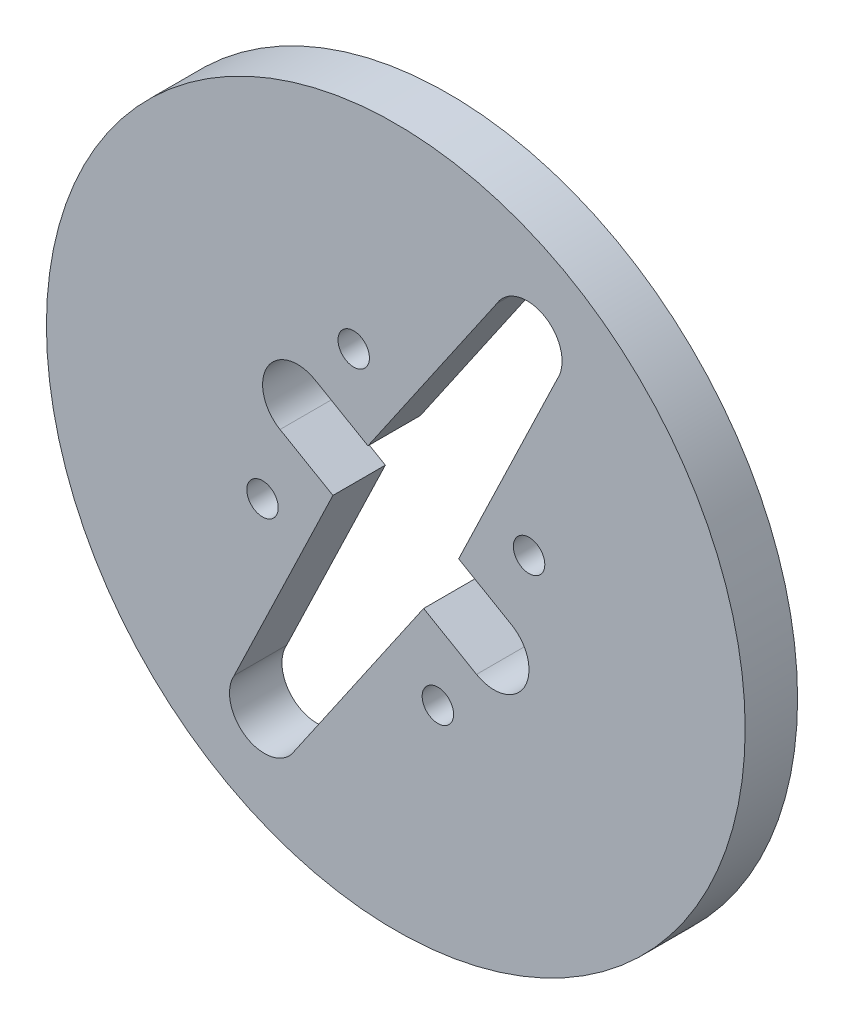
ISO-10303-21;
HEADER;
FILE_DESCRIPTION(('STEP AP214'),'2;1');
FILE_NAME('part.step','',(''),(''),'','','');
FILE_SCHEMA(('AUTOMOTIVE_DESIGN { 1 0 10303 214 1 1 1 1 }'));
ENDSEC;
DATA;
#1=APPLICATION_CONTEXT('core data for automotive mechanical design processes');
#2=APPLICATION_PROTOCOL_DEFINITION('international standard','automotive_design',2000,#1);
#3=PRODUCT_CONTEXT('',#1,'mechanical');
#4=PRODUCT('Part','Part','',(#3));
#5=PRODUCT_RELATED_PRODUCT_CATEGORY('part','',(#4));
#6=PRODUCT_DEFINITION_FORMATION('','',#4);
#7=PRODUCT_DEFINITION_CONTEXT('part definition',#1,'design');
#8=PRODUCT_DEFINITION('design','',#6,#7);
#9=PRODUCT_DEFINITION_SHAPE('','',#8);
#10=(LENGTH_UNIT() NAMED_UNIT(*) SI_UNIT(.MILLI.,.METRE.));
#11=(NAMED_UNIT(*) PLANE_ANGLE_UNIT() SI_UNIT($,.RADIAN.));
#12=(NAMED_UNIT(*) SI_UNIT($,.STERADIAN.) SOLID_ANGLE_UNIT());
#13=UNCERTAINTY_MEASURE_WITH_UNIT(LENGTH_MEASURE(1.E-05),#10,'distance_accuracy_value','');
#14=(GEOMETRIC_REPRESENTATION_CONTEXT(3) GLOBAL_UNCERTAINTY_ASSIGNED_CONTEXT((#13)) GLOBAL_UNIT_ASSIGNED_CONTEXT((#10,
#11,#12)) REPRESENTATION_CONTEXT('',''));
#15=CARTESIAN_POINT('',(0.,0.,0.));
#16=DIRECTION('',(0.,0.,1.));
#17=DIRECTION('',(1.,0.,0.));
#18=AXIS2_PLACEMENT_3D('',#15,#16,#17);
#19=CARTESIAN_POINT('',(2.59213585311026,-1.7801873533811,3.));
#20=DIRECTION('',(0.824324794546752,-0.566117154920654,0.));
#21=DIRECTION('',(0.566117154920654,0.824324794546752,0.));
#22=AXIS2_PLACEMENT_3D('',#19,#20,#21);
#23=PLANE('',#22);
#24=DIRECTION('',(-0.566117154920654,-0.824324794546752,0.));
#25=VECTOR('',#24,1.);
#26=CARTESIAN_POINT('',(2.59213585311026,-1.7801873533811,0.));
#27=LINE('',#26,#25);
#28=CARTESIAN_POINT('',(1.5934941670672,-3.23431234415027,0.));
#29=VERTEX_POINT('',#28);
#30=CARTESIAN_POINT('',(-5.78777046890322,-13.982192710705,0.));
#31=VERTEX_POINT('',#30);
#32=EDGE_CURVE('E161',#29,#31,#27,.T.);
#33=ORIENTED_EDGE('',*,*,#32,.T.);
#34=DIRECTION('',(0.,0.,-1.));
#35=VECTOR('',#34,1.);
#36=CARTESIAN_POINT('',(-5.78777046890322,-13.982192710705,3.));
#37=LINE('',#36,#35);
#38=CARTESIAN_POINT('',(-5.78777046890322,-13.982192710705,3.));
#39=VERTEX_POINT('',#38);
#40=EDGE_CURVE('E11',#39,#31,#37,.T.);
#41=ORIENTED_EDGE('',*,*,#40,.F.);
#42=DIRECTION('',(-0.566117154920654,-0.824324794546752,0.));
#43=VECTOR('',#42,1.);
#44=CARTESIAN_POINT('',(2.59213585311026,-1.7801873533811,3.));
#45=LINE('',#44,#43);
#46=CARTESIAN_POINT('',(1.5934941670672,-3.23431234415027,3.));
#47=VERTEX_POINT('',#46);
#48=EDGE_CURVE('E226',#47,#39,#45,.T.);
#49=ORIENTED_EDGE('',*,*,#48,.F.);
#50=DIRECTION('',(0.,0.,-1.));
#51=VECTOR('',#50,1.);
#52=CARTESIAN_POINT('',(1.5934941670672,-3.23431234415027,3.));
#53=LINE('',#52,#51);
#54=EDGE_CURVE('E50',#47,#29,#53,.T.);
#55=ORIENTED_EDGE('',*,*,#54,.T.);
#56=EDGE_LOOP('',(#33,#41,#49,#55));
#57=FACE_BOUND('',#56,.T.);
#58=ADVANCED_FACE('F33',(#57),#23,.F.);
#59=CARTESIAN_POINT('',(-7.51840234421123,-12.9797390648102,3.));
#60=DIRECTION('',(0.,0.,-1.));
#61=DIRECTION('',(-1.,0.,0.));
#62=AXIS2_PLACEMENT_3D('',#59,#60,#61);
#63=CYLINDRICAL_SURFACE('',#62,2.);
#64=CARTESIAN_POINT('',(-7.51840234421123,-12.9797390648102,0.));
#65=DIRECTION('',(0.,0.,1.));
#66=DIRECTION('',(1.,0.,0.));
#67=AXIS2_PLACEMENT_3D('',#64,#65,#66);
#68=CIRCLE('',#67,2.);
#69=CARTESIAN_POINT('',(-9.24903421951926,-11.9772854189153,0.));
#70=VERTEX_POINT('',#69);
#71=EDGE_CURVE('E164',#31,#70,#68,.F.);
#72=ORIENTED_EDGE('',*,*,#71,.T.);
#73=DIRECTION('',(0.,0.,-1.));
#74=VECTOR('',#73,1.);
#75=CARTESIAN_POINT('',(-9.24903421951926,-11.9772854189153,3.));
#76=LINE('',#75,#74);
#77=CARTESIAN_POINT('',(-9.24903421951926,-11.9772854189153,3.));
#78=VERTEX_POINT('',#77);
#79=EDGE_CURVE('E42',#78,#70,#76,.T.);
#80=ORIENTED_EDGE('',*,*,#79,.F.);
#81=CARTESIAN_POINT('',(-7.51840234421123,-12.9797390648102,3.));
#82=DIRECTION('',(0.,0.,1.));
#83=DIRECTION('',(1.,0.,0.));
#84=AXIS2_PLACEMENT_3D('',#81,#82,#83);
#85=CIRCLE('',#84,2.);
#86=EDGE_CURVE('E100',#39,#78,#85,.F.);
#87=ORIENTED_EDGE('',*,*,#86,.F.);
#88=ORIENTED_EDGE('',*,*,#40,.T.);
#89=EDGE_LOOP('',(#72,#80,#87,#88));
#90=FACE_BOUND('',#89,.T.);
#91=ADVANCED_FACE('F211',(#90),#63,.F.);
#92=CARTESIAN_POINT('',(-2.83390408535548,1.36279966580681,3.));
#93=DIRECTION('',(0.901209479481125,-0.433383749226202,0.));
#94=DIRECTION('',(0.433383749226202,0.901209479481125,0.));
#95=AXIS2_PLACEMENT_3D('',#92,#93,#94);
#96=PLANE('',#95);
#97=DIRECTION('',(-0.433383749226202,-0.901209479481125,0.));
#98=VECTOR('',#97,1.);
#99=CARTESIAN_POINT('',(-2.83390408535548,1.36279966580681,0.));
#100=LINE('',#99,#98);
#101=CARTESIAN_POINT('',(-3.59840145885687,-0.226951406465772,0.));
#102=VERTEX_POINT('',#101);
#103=EDGE_CURVE('E167',#102,#70,#100,.T.);
#104=ORIENTED_EDGE('',*,*,#103,.F.);
#105=DIRECTION('',(0.,0.,-1.));
#106=VECTOR('',#105,1.);
#107=CARTESIAN_POINT('',(-3.59840145885687,-0.226951406465772,3.));
#108=LINE('',#107,#106);
#109=CARTESIAN_POINT('',(-3.59840145885687,-0.226951406465772,3.));
#110=VERTEX_POINT('',#109);
#111=EDGE_CURVE('E204',#110,#102,#108,.T.);
#112=ORIENTED_EDGE('',*,*,#111,.F.);
#113=DIRECTION('',(-0.433383749226202,-0.901209479481125,0.));
#114=VECTOR('',#113,1.);
#115=CARTESIAN_POINT('',(-2.83390408535548,1.36279966580681,3.));
#116=LINE('',#115,#114);
#117=EDGE_CURVE('E210',#110,#78,#116,.T.);
#118=ORIENTED_EDGE('',*,*,#117,.T.);
#119=ORIENTED_EDGE('',*,*,#79,.T.);
#120=EDGE_LOOP('',(#104,#112,#118,#119));
#121=FACE_BOUND('',#120,.T.);
#122=ADVANCED_FACE('F208',(#121),#96,.T.);
#123=CARTESIAN_POINT('',(-1.00245364589483,-1.73063187530802,3.));
#124=DIRECTION('',(0.501226822947415,0.865315937654011,0.));
#125=DIRECTION('',(-0.865315937654011,0.501226822947416,0.));
#126=AXIS2_PLACEMENT_3D('',#123,#124,#125);
#127=PLANE('',#126);
#128=DIRECTION('',(0.865315937654011,-0.501226822947416,0.));
#129=VECTOR('',#128,1.);
#130=CARTESIAN_POINT('',(-1.00245364589483,-1.73063187530802,0.));
#131=LINE('',#130,#129);
#132=CARTESIAN_POINT('',(-6.6270072406459,1.52734247385018,0.));
#133=VERTEX_POINT('',#132);
#134=EDGE_CURVE('E170',#133,#102,#131,.T.);
#135=ORIENTED_EDGE('',*,*,#134,.F.);
#136=DIRECTION('',(0.,0.,-1.));
#137=VECTOR('',#136,1.);
#138=CARTESIAN_POINT('',(-6.6270072406459,1.52734247385018,3.));
#139=LINE('',#138,#137);
#140=CARTESIAN_POINT('',(-6.6270072406459,1.52734247385018,3.));
#141=VERTEX_POINT('',#140);
#142=EDGE_CURVE('E202',#141,#133,#139,.T.);
#143=ORIENTED_EDGE('',*,*,#142,.F.);
#144=DIRECTION('',(0.865315937654011,-0.501226822947416,0.));
#145=VECTOR('',#144,1.);
#146=CARTESIAN_POINT('',(-1.00245364589483,-1.73063187530802,3.));
#147=LINE('',#146,#145);
#148=EDGE_CURVE('E154',#141,#110,#147,.T.);
#149=ORIENTED_EDGE('',*,*,#148,.T.);
#150=ORIENTED_EDGE('',*,*,#111,.T.);
#151=EDGE_LOOP('',(#135,#143,#149,#150));
#152=FACE_BOUND('',#151,.T.);
#153=ADVANCED_FACE('F219',(#152),#127,.T.);
#154=CARTESIAN_POINT('',(-5.62455359475107,3.2579743491582,3.));
#155=DIRECTION('',(0.,0.,-1.));
#156=DIRECTION('',(-1.,0.,0.));
#157=AXIS2_PLACEMENT_3D('',#154,#155,#156);
#158=CYLINDRICAL_SURFACE('',#157,2.);
#159=CARTESIAN_POINT('',(-5.62455359475107,3.2579743491582,0.));
#160=DIRECTION('',(0.,0.,1.));
#161=DIRECTION('',(1.,0.,0.));
#162=AXIS2_PLACEMENT_3D('',#159,#160,#161);
#163=CIRCLE('',#162,2.);
#164=CARTESIAN_POINT('',(-4.62209994885624,4.98860622446622,0.));
#165=VERTEX_POINT('',#164);
#166=EDGE_CURVE('E173',#165,#133,#163,.T.);
#167=ORIENTED_EDGE('',*,*,#166,.F.);
#168=DIRECTION('',(0.,0.,-1.));
#169=VECTOR('',#168,1.);
#170=CARTESIAN_POINT('',(-4.62209994885624,4.98860622446622,3.));
#171=LINE('',#170,#169);
#172=CARTESIAN_POINT('',(-4.62209994885624,4.98860622446622,3.));
#173=VERTEX_POINT('',#172);
#174=EDGE_CURVE('E200',#173,#165,#171,.T.);
#175=ORIENTED_EDGE('',*,*,#174,.F.);
#176=CARTESIAN_POINT('',(-5.62455359475107,3.2579743491582,3.));
#177=DIRECTION('',(0.,0.,1.));
#178=DIRECTION('',(1.,0.,0.));
#179=AXIS2_PLACEMENT_3D('',#176,#177,#178);
#180=CIRCLE('',#179,2.);
#181=EDGE_CURVE('E225',#173,#141,#180,.T.);
#182=ORIENTED_EDGE('',*,*,#181,.T.);
#183=ORIENTED_EDGE('',*,*,#142,.T.);
#184=EDGE_LOOP('',(#167,#175,#182,#183));
#185=FACE_BOUND('',#184,.T.);
#186=ADVANCED_FACE('F308',(#185),#158,.F.);
#187=CARTESIAN_POINT('',(1.00245364589483,1.73063187530802,3.));
#188=DIRECTION('',(0.501226822947415,0.865315937654011,0.));
#189=DIRECTION('',(-0.865315937654011,0.501226822947416,0.));
#190=AXIS2_PLACEMENT_3D('',#187,#188,#189);
#191=PLANE('',#190);
#192=DIRECTION('',(0.865315937654011,-0.501226822947416,0.));
#193=VECTOR('',#192,1.);
#194=CARTESIAN_POINT('',(1.00245364589483,1.73063187530802,0.));
#195=LINE('',#194,#193);
#196=CARTESIAN_POINT('',(-1.5934941670672,3.23431234415027,0.));
#197=VERTEX_POINT('',#196);
#198=EDGE_CURVE('E177',#165,#197,#195,.T.);
#199=ORIENTED_EDGE('',*,*,#198,.T.);
#200=DIRECTION('',(0.,0.,-1.));
#201=VECTOR('',#200,1.);
#202=CARTESIAN_POINT('',(-1.5934941670672,3.23431234415027,3.));
#203=LINE('',#202,#201);
#204=CARTESIAN_POINT('',(-1.5934941670672,3.23431234415027,3.));
#205=VERTEX_POINT('',#204);
#206=EDGE_CURVE('E197',#205,#197,#203,.T.);
#207=ORIENTED_EDGE('',*,*,#206,.F.);
#208=DIRECTION('',(0.865315937654011,-0.501226822947416,0.));
#209=VECTOR('',#208,1.);
#210=CARTESIAN_POINT('',(1.00245364589483,1.73063187530802,3.));
#211=LINE('',#210,#209);
#212=EDGE_CURVE('E140',#173,#205,#211,.T.);
#213=ORIENTED_EDGE('',*,*,#212,.F.);
#214=ORIENTED_EDGE('',*,*,#174,.T.);
#215=EDGE_LOOP('',(#199,#207,#213,#214));
#216=FACE_BOUND('',#215,.T.);
#217=ADVANCED_FACE('F311',(#216),#191,.F.);
#218=CARTESIAN_POINT('',(-2.59213585311026,1.7801873533811,3.));
#219=DIRECTION('',(-0.824324794546752,0.566117154920654,0.));
#220=DIRECTION('',(-0.566117154920654,-0.824324794546752,0.));
#221=AXIS2_PLACEMENT_3D('',#218,#219,#220);
#222=PLANE('',#221);
#223=DIRECTION('',(0.566117154920654,0.824324794546752,0.));
#224=VECTOR('',#223,1.);
#225=CARTESIAN_POINT('',(-2.59213585311026,1.7801873533811,0.));
#226=LINE('',#225,#224);
#227=CARTESIAN_POINT('',(5.78777046890321,13.982192710705,0.));
#228=VERTEX_POINT('',#227);
#229=EDGE_CURVE('E179',#197,#228,#226,.T.);
#230=ORIENTED_EDGE('',*,*,#229,.T.);
#231=DIRECTION('',(0.,0.,-1.));
#232=VECTOR('',#231,1.);
#233=CARTESIAN_POINT('',(5.78777046890321,13.982192710705,3.));
#234=LINE('',#233,#232);
#235=CARTESIAN_POINT('',(5.78777046890321,13.982192710705,3.));
#236=VERTEX_POINT('',#235);
#237=EDGE_CURVE('E195',#236,#228,#234,.T.);
#238=ORIENTED_EDGE('',*,*,#237,.F.);
#239=DIRECTION('',(0.566117154920654,0.824324794546752,0.));
#240=VECTOR('',#239,1.);
#241=CARTESIAN_POINT('',(-2.59213585311026,1.7801873533811,3.));
#242=LINE('',#241,#240);
#243=EDGE_CURVE('E231',#205,#236,#242,.T.);
#244=ORIENTED_EDGE('',*,*,#243,.F.);
#245=ORIENTED_EDGE('',*,*,#206,.T.);
#246=EDGE_LOOP('',(#230,#238,#244,#245));
#247=FACE_BOUND('',#246,.T.);
#248=ADVANCED_FACE('F313',(#247),#222,.F.);
#249=CARTESIAN_POINT('',(7.51840234421123,12.9797390648102,3.));
#250=DIRECTION('',(0.,0.,-1.));
#251=DIRECTION('',(-1.,0.,0.));
#252=AXIS2_PLACEMENT_3D('',#249,#250,#251);
#253=CYLINDRICAL_SURFACE('',#252,2.);
#254=CARTESIAN_POINT('',(7.51840234421123,12.9797390648102,0.));
#255=DIRECTION('',(0.,0.,1.));
#256=DIRECTION('',(1.,0.,0.));
#257=AXIS2_PLACEMENT_3D('',#254,#255,#256);
#258=CIRCLE('',#257,2.);
#259=CARTESIAN_POINT('',(9.24903421951925,11.9772854189153,0.));
#260=VERTEX_POINT('',#259);
#261=EDGE_CURVE('E182',#260,#228,#258,.T.);
#262=ORIENTED_EDGE('',*,*,#261,.F.);
#263=DIRECTION('',(0.,0.,-1.));
#264=VECTOR('',#263,1.);
#265=CARTESIAN_POINT('',(9.24903421951925,11.9772854189153,3.));
#266=LINE('',#265,#264);
#267=CARTESIAN_POINT('',(9.24903421951925,11.9772854189153,3.));
#268=VERTEX_POINT('',#267);
#269=EDGE_CURVE('E193',#268,#260,#266,.T.);
#270=ORIENTED_EDGE('',*,*,#269,.F.);
#271=CARTESIAN_POINT('',(7.51840234421123,12.9797390648102,3.));
#272=DIRECTION('',(0.,0.,1.));
#273=DIRECTION('',(1.,0.,0.));
#274=AXIS2_PLACEMENT_3D('',#271,#272,#273);
#275=CIRCLE('',#274,2.);
#276=EDGE_CURVE('E232',#268,#236,#275,.T.);
#277=ORIENTED_EDGE('',*,*,#276,.T.);
#278=ORIENTED_EDGE('',*,*,#237,.T.);
#279=EDGE_LOOP('',(#262,#270,#277,#278));
#280=FACE_BOUND('',#279,.T.);
#281=ADVANCED_FACE('F316',(#280),#253,.F.);
#282=CARTESIAN_POINT('',(2.83390408535548,-1.36279966580681,3.));
#283=DIRECTION('',(-0.901209479481125,0.433383749226202,0.));
#284=DIRECTION('',(-0.433383749226202,-0.901209479481125,0.));
#285=AXIS2_PLACEMENT_3D('',#282,#283,#284);
#286=PLANE('',#285);
#287=DIRECTION('',(0.433383749226202,0.901209479481125,0.));
#288=VECTOR('',#287,1.);
#289=CARTESIAN_POINT('',(2.83390408535548,-1.36279966580681,0.));
#290=LINE('',#289,#288);
#291=CARTESIAN_POINT('',(3.59840145885686,0.226951406465775,0.));
#292=VERTEX_POINT('',#291);
#293=EDGE_CURVE('E185',#292,#260,#290,.T.);
#294=ORIENTED_EDGE('',*,*,#293,.F.);
#295=DIRECTION('',(0.,0.,-1.));
#296=VECTOR('',#295,1.);
#297=CARTESIAN_POINT('',(3.59840145885686,0.226951406465775,3.));
#298=LINE('',#297,#296);
#299=CARTESIAN_POINT('',(3.59840145885686,0.226951406465775,3.));
#300=VERTEX_POINT('',#299);
#301=EDGE_CURVE('E148',#300,#292,#298,.T.);
#302=ORIENTED_EDGE('',*,*,#301,.F.);
#303=DIRECTION('',(0.433383749226202,0.901209479481125,0.));
#304=VECTOR('',#303,1.);
#305=CARTESIAN_POINT('',(2.83390408535548,-1.36279966580681,3.));
#306=LINE('',#305,#304);
#307=EDGE_CURVE('E137',#300,#268,#306,.T.);
#308=ORIENTED_EDGE('',*,*,#307,.T.);
#309=ORIENTED_EDGE('',*,*,#269,.T.);
#310=EDGE_LOOP('',(#294,#302,#308,#309));
#311=FACE_BOUND('',#310,.T.);
#312=ADVANCED_FACE('F237',(#311),#286,.T.);
#313=CARTESIAN_POINT('',(6.6270072406459,-1.52734247385018,0.));
#314=VERTEX_POINT('',#313);
#315=EDGE_CURVE('E145',#292,#314,#195,.T.);
#316=ORIENTED_EDGE('',*,*,#315,.T.);
#317=DIRECTION('',(0.,0.,-1.));
#318=VECTOR('',#317,1.);
#319=CARTESIAN_POINT('',(6.6270072406459,-1.52734247385018,3.));
#320=LINE('',#319,#318);
#321=CARTESIAN_POINT('',(6.6270072406459,-1.52734247385018,3.));
#322=VERTEX_POINT('',#321);
#323=EDGE_CURVE('E142',#322,#314,#320,.T.);
#324=ORIENTED_EDGE('',*,*,#323,.F.);
#325=EDGE_CURVE('E129',#300,#322,#211,.T.);
#326=ORIENTED_EDGE('',*,*,#325,.F.);
#327=ORIENTED_EDGE('',*,*,#301,.T.);
#328=EDGE_LOOP('',(#316,#324,#326,#327));
#329=FACE_BOUND('',#328,.T.);
#330=ADVANCED_FACE('F143',(#329),#191,.F.);
#331=CARTESIAN_POINT('',(5.62455359475107,-3.2579743491582,3.));
#332=DIRECTION('',(0.,0.,-1.));
#333=DIRECTION('',(-1.,0.,0.));
#334=AXIS2_PLACEMENT_3D('',#331,#332,#333);
#335=CYLINDRICAL_SURFACE('',#334,2.);
#336=CARTESIAN_POINT('',(5.62455359475107,-3.2579743491582,0.));
#337=DIRECTION('',(0.,0.,1.));
#338=DIRECTION('',(1.,0.,0.));
#339=AXIS2_PLACEMENT_3D('',#336,#337,#338);
#340=CIRCLE('',#339,2.);
#341=CARTESIAN_POINT('',(4.62209994885624,-4.98860622446622,0.));
#342=VERTEX_POINT('',#341);
#343=EDGE_CURVE('E188',#342,#314,#340,.T.);
#344=ORIENTED_EDGE('',*,*,#343,.F.);
#345=DIRECTION('',(0.,0.,-1.));
#346=VECTOR('',#345,1.);
#347=CARTESIAN_POINT('',(4.62209994885624,-4.98860622446622,3.));
#348=LINE('',#347,#346);
#349=CARTESIAN_POINT('',(4.62209994885624,-4.98860622446622,3.));
#350=VERTEX_POINT('',#349);
#351=EDGE_CURVE('E88',#350,#342,#348,.T.);
#352=ORIENTED_EDGE('',*,*,#351,.F.);
#353=CARTESIAN_POINT('',(5.62455359475107,-3.2579743491582,3.));
#354=DIRECTION('',(0.,0.,1.));
#355=DIRECTION('',(1.,0.,0.));
#356=AXIS2_PLACEMENT_3D('',#353,#354,#355);
#357=CIRCLE('',#356,2.);
#358=EDGE_CURVE('E134',#350,#322,#357,.T.);
#359=ORIENTED_EDGE('',*,*,#358,.T.);
#360=ORIENTED_EDGE('',*,*,#323,.T.);
#361=EDGE_LOOP('',(#344,#352,#359,#360));
#362=FACE_BOUND('',#361,.T.);
#363=ADVANCED_FACE('F150',(#362),#335,.F.);
#364=CARTESIAN_POINT('',(0.,0.,3.));
#365=DIRECTION('',(0.,0.,-1.));
#366=DIRECTION('',(-1.,0.,0.));
#367=AXIS2_PLACEMENT_3D('',#364,#365,#366);
#368=CYLINDRICAL_SURFACE('',#367,20.);
#369=CARTESIAN_POINT('',(0.,0.,3.));
#370=DIRECTION('',(0.,0.,1.));
#371=DIRECTION('',(1.,0.,0.));
#372=AXIS2_PLACEMENT_3D('',#369,#370,#371);
#373=CIRCLE('',#372,20.);
#374=CARTESIAN_POINT('',(20.,0.,3.));
#375=VERTEX_POINT('',#374);
#376=EDGE_CURVE('E240',#375,#375,#373,.T.);
#377=ORIENTED_EDGE('',*,*,#376,.F.);
#378=EDGE_LOOP('',(#377));
#379=FACE_BOUND('',#378,.T.);
#380=CARTESIAN_POINT('',(0.,0.,0.));
#381=DIRECTION('',(0.,0.,1.));
#382=DIRECTION('',(1.,0.,0.));
#383=AXIS2_PLACEMENT_3D('',#380,#381,#382);
#384=CIRCLE('',#383,20.);
#385=CARTESIAN_POINT('',(20.,0.,0.));
#386=VERTEX_POINT('',#385);
#387=EDGE_CURVE('E158',#386,#386,#384,.T.);
#388=ORIENTED_EDGE('',*,*,#387,.T.);
#389=EDGE_LOOP('',(#388));
#390=FACE_BOUND('',#389,.T.);
#391=ADVANCED_FACE('F35',(#379,#390),#368,.T.);
#392=EDGE_CURVE('E174',#29,#342,#131,.T.);
#393=ORIENTED_EDGE('',*,*,#392,.F.);
#394=ORIENTED_EDGE('',*,*,#54,.F.);
#395=EDGE_CURVE('E151',#47,#350,#147,.T.);
#396=ORIENTED_EDGE('',*,*,#395,.T.);
#397=ORIENTED_EDGE('',*,*,#351,.T.);
#398=EDGE_LOOP('',(#393,#394,#396,#397));
#399=FACE_BOUND('',#398,.T.);
#400=ADVANCED_FACE('F292',(#399),#127,.T.);
#401=CARTESIAN_POINT('',(0.,0.,3.));
#402=DIRECTION('',(0.,0.,1.));
#403=DIRECTION('',(1.,0.,0.));
#404=AXIS2_PLACEMENT_3D('',#401,#402,#403);
#405=PLANE('',#404);
#406=CARTESIAN_POINT('',(2.40897824904752,-7.62868427683411,3.));
#407=DIRECTION('',(0.,0.,-1.));
#408=DIRECTION('',(-1.,0.,0.));
#409=AXIS2_PLACEMENT_3D('',#406,#407,#408);
#410=CIRCLE('',#409,0.9);
#411=CARTESIAN_POINT('',(1.50897824904752,-7.62868427683411,3.));
#412=VERTEX_POINT('',#411);
#413=EDGE_CURVE('E162',#412,#412,#410,.T.);
#414=ORIENTED_EDGE('',*,*,#413,.T.);
#415=EDGE_LOOP('',(#414));
#416=FACE_BOUND('',#415,.T.);
#417=CARTESIAN_POINT('',(7.62868427683411,2.40897824904752,3.));
#418=DIRECTION('',(0.,0.,-1.));
#419=DIRECTION('',(-1.,0.,0.));
#420=AXIS2_PLACEMENT_3D('',#417,#418,#419);
#421=CIRCLE('',#420,0.9);
#422=CARTESIAN_POINT('',(6.72868427683411,2.40897824904752,3.));
#423=VERTEX_POINT('',#422);
#424=EDGE_CURVE('E261',#423,#423,#421,.T.);
#425=ORIENTED_EDGE('',*,*,#424,.T.);
#426=EDGE_LOOP('',(#425));
#427=FACE_BOUND('',#426,.T.);
#428=CARTESIAN_POINT('',(-2.40897824904752,7.62868427683411,3.));
#429=DIRECTION('',(0.,0.,-1.));
#430=DIRECTION('',(-1.,0.,0.));
#431=AXIS2_PLACEMENT_3D('',#428,#429,#430);
#432=CIRCLE('',#431,0.9);
#433=CARTESIAN_POINT('',(-3.30897824904752,7.62868427683411,3.));
#434=VERTEX_POINT('',#433);
#435=EDGE_CURVE('E255',#434,#434,#432,.T.);
#436=ORIENTED_EDGE('',*,*,#435,.T.);
#437=EDGE_LOOP('',(#436));
#438=FACE_BOUND('',#437,.T.);
#439=CARTESIAN_POINT('',(-7.62868427683411,-2.40897824904752,3.));
#440=DIRECTION('',(0.,0.,-1.));
#441=DIRECTION('',(-1.,0.,0.));
#442=AXIS2_PLACEMENT_3D('',#439,#440,#441);
#443=CIRCLE('',#442,0.899999999999999);
#444=CARTESIAN_POINT('',(-8.52868427683411,-2.40897824904752,3.));
#445=VERTEX_POINT('',#444);
#446=EDGE_CURVE('E249',#445,#445,#443,.T.);
#447=ORIENTED_EDGE('',*,*,#446,.T.);
#448=EDGE_LOOP('',(#447));
#449=FACE_BOUND('',#448,.T.);
#450=ORIENTED_EDGE('',*,*,#376,.T.);
#451=EDGE_LOOP('',(#450));
#452=FACE_BOUND('',#451,.T.);
#453=ORIENTED_EDGE('',*,*,#48,.T.);
#454=ORIENTED_EDGE('',*,*,#86,.T.);
#455=ORIENTED_EDGE('',*,*,#117,.F.);
#456=ORIENTED_EDGE('',*,*,#148,.F.);
#457=ORIENTED_EDGE('',*,*,#181,.F.);
#458=ORIENTED_EDGE('',*,*,#212,.T.);
#459=ORIENTED_EDGE('',*,*,#243,.T.);
#460=ORIENTED_EDGE('',*,*,#276,.F.);
#461=ORIENTED_EDGE('',*,*,#307,.F.);
#462=ORIENTED_EDGE('',*,*,#325,.T.);
#463=ORIENTED_EDGE('',*,*,#358,.F.);
#464=ORIENTED_EDGE('',*,*,#395,.F.);
#465=EDGE_LOOP('',(#453,#454,#455,#456,#457,#458,#459,#460,#461,#462,#463,#464));
#466=FACE_BOUND('',#465,.T.);
#467=ADVANCED_FACE('F131',(#416,#427,#438,#449,#452,#466),#405,.T.);
#468=CARTESIAN_POINT('',(0.,0.,0.));
#469=DIRECTION('',(0.,0.,1.));
#470=DIRECTION('',(1.,0.,0.));
#471=AXIS2_PLACEMENT_3D('',#468,#469,#470);
#472=PLANE('',#471);
#473=CARTESIAN_POINT('',(2.40897824904752,-7.62868427683411,0.));
#474=DIRECTION('',(0.,0.,-1.));
#475=DIRECTION('',(-1.,0.,0.));
#476=AXIS2_PLACEMENT_3D('',#473,#474,#475);
#477=CIRCLE('',#476,0.9);
#478=CARTESIAN_POINT('',(1.50897824904752,-7.62868427683411,0.));
#479=VERTEX_POINT('',#478);
#480=EDGE_CURVE('E264',#479,#479,#477,.T.);
#481=ORIENTED_EDGE('',*,*,#480,.F.);
#482=EDGE_LOOP('',(#481));
#483=FACE_BOUND('',#482,.T.);
#484=CARTESIAN_POINT('',(7.62868427683411,2.40897824904752,0.));
#485=DIRECTION('',(0.,0.,-1.));
#486=DIRECTION('',(-1.,0.,0.));
#487=AXIS2_PLACEMENT_3D('',#484,#485,#486);
#488=CIRCLE('',#487,0.9);
#489=CARTESIAN_POINT('',(6.72868427683411,2.40897824904752,0.));
#490=VERTEX_POINT('',#489);
#491=EDGE_CURVE('E258',#490,#490,#488,.T.);
#492=ORIENTED_EDGE('',*,*,#491,.F.);
#493=EDGE_LOOP('',(#492));
#494=FACE_BOUND('',#493,.T.);
#495=CARTESIAN_POINT('',(-2.40897824904752,7.62868427683411,0.));
#496=DIRECTION('',(0.,0.,-1.));
#497=DIRECTION('',(-1.,0.,0.));
#498=AXIS2_PLACEMENT_3D('',#495,#496,#497);
#499=CIRCLE('',#498,0.9);
#500=CARTESIAN_POINT('',(-3.30897824904752,7.62868427683411,0.));
#501=VERTEX_POINT('',#500);
#502=EDGE_CURVE('E252',#501,#501,#499,.T.);
#503=ORIENTED_EDGE('',*,*,#502,.F.);
#504=EDGE_LOOP('',(#503));
#505=FACE_BOUND('',#504,.T.);
#506=CARTESIAN_POINT('',(-7.62868427683411,-2.40897824904752,0.));
#507=DIRECTION('',(0.,0.,-1.));
#508=DIRECTION('',(-1.,0.,0.));
#509=AXIS2_PLACEMENT_3D('',#506,#507,#508);
#510=CIRCLE('',#509,0.899999999999999);
#511=CARTESIAN_POINT('',(-8.52868427683411,-2.40897824904752,0.));
#512=VERTEX_POINT('',#511);
#513=EDGE_CURVE('E246',#512,#512,#510,.T.);
#514=ORIENTED_EDGE('',*,*,#513,.F.);
#515=EDGE_LOOP('',(#514));
#516=FACE_BOUND('',#515,.T.);
#517=ORIENTED_EDGE('',*,*,#387,.F.);
#518=EDGE_LOOP('',(#517));
#519=FACE_BOUND('',#518,.T.);
#520=ORIENTED_EDGE('',*,*,#32,.F.);
#521=ORIENTED_EDGE('',*,*,#392,.T.);
#522=ORIENTED_EDGE('',*,*,#343,.T.);
#523=ORIENTED_EDGE('',*,*,#315,.F.);
#524=ORIENTED_EDGE('',*,*,#293,.T.);
#525=ORIENTED_EDGE('',*,*,#261,.T.);
#526=ORIENTED_EDGE('',*,*,#229,.F.);
#527=ORIENTED_EDGE('',*,*,#198,.F.);
#528=ORIENTED_EDGE('',*,*,#166,.T.);
#529=ORIENTED_EDGE('',*,*,#134,.T.);
#530=ORIENTED_EDGE('',*,*,#103,.T.);
#531=ORIENTED_EDGE('',*,*,#71,.F.);
#532=EDGE_LOOP('',(#520,#521,#522,#523,#524,#525,#526,#527,#528,#529,#530,#531));
#533=FACE_BOUND('',#532,.T.);
#534=ADVANCED_FACE('F214',(#483,#494,#505,#516,#519,#533),#472,.F.);
#535=CARTESIAN_POINT('',(-7.62868427683411,-2.40897824904752,3.));
#536=DIRECTION('',(0.,0.,-1.));
#537=DIRECTION('',(-1.,0.,0.));
#538=AXIS2_PLACEMENT_3D('',#535,#536,#537);
#539=CYLINDRICAL_SURFACE('',#538,0.899999999999999);
#540=ORIENTED_EDGE('',*,*,#446,.F.);
#541=EDGE_LOOP('',(#540));
#542=FACE_BOUND('',#541,.T.);
#543=ORIENTED_EDGE('',*,*,#513,.T.);
#544=EDGE_LOOP('',(#543));
#545=FACE_BOUND('',#544,.T.);
#546=ADVANCED_FACE('F281',(#542,#545),#539,.F.);
#547=CARTESIAN_POINT('',(-2.40897824904752,7.62868427683411,3.));
#548=DIRECTION('',(0.,0.,-1.));
#549=DIRECTION('',(-1.,0.,0.));
#550=AXIS2_PLACEMENT_3D('',#547,#548,#549);
#551=CYLINDRICAL_SURFACE('',#550,0.9);
#552=ORIENTED_EDGE('',*,*,#435,.F.);
#553=EDGE_LOOP('',(#552));
#554=FACE_BOUND('',#553,.T.);
#555=ORIENTED_EDGE('',*,*,#502,.T.);
#556=EDGE_LOOP('',(#555));
#557=FACE_BOUND('',#556,.T.);
#558=ADVANCED_FACE('F328',(#554,#557),#551,.F.);
#559=CARTESIAN_POINT('',(7.62868427683411,2.40897824904752,3.));
#560=DIRECTION('',(0.,0.,-1.));
#561=DIRECTION('',(-1.,0.,0.));
#562=AXIS2_PLACEMENT_3D('',#559,#560,#561);
#563=CYLINDRICAL_SURFACE('',#562,0.9);
#564=ORIENTED_EDGE('',*,*,#424,.F.);
#565=EDGE_LOOP('',(#564));
#566=FACE_BOUND('',#565,.T.);
#567=ORIENTED_EDGE('',*,*,#491,.T.);
#568=EDGE_LOOP('',(#567));
#569=FACE_BOUND('',#568,.T.);
#570=ADVANCED_FACE('F275',(#566,#569),#563,.F.);
#571=CARTESIAN_POINT('',(2.40897824904752,-7.62868427683411,3.));
#572=DIRECTION('',(0.,0.,-1.));
#573=DIRECTION('',(-1.,0.,0.));
#574=AXIS2_PLACEMENT_3D('',#571,#572,#573);
#575=CYLINDRICAL_SURFACE('',#574,0.9);
#576=ORIENTED_EDGE('',*,*,#413,.F.);
#577=EDGE_LOOP('',(#576));
#578=FACE_BOUND('',#577,.T.);
#579=ORIENTED_EDGE('',*,*,#480,.T.);
#580=EDGE_LOOP('',(#579));
#581=FACE_BOUND('',#580,.T.);
#582=ADVANCED_FACE('F272',(#578,#581),#575,.F.);
#583=CLOSED_SHELL('',(#58,#91,#122,#153,#186,#217,#248,#281,#312,#330,#363,#391,#400,#467,#534,
#546,#558,#570,#582));
#584=MANIFOLD_SOLID_BREP('B2',#583);
#585=ADVANCED_BREP_SHAPE_REPRESENTATION('',(#18,#584),#14);
#586=SHAPE_DEFINITION_REPRESENTATION(#9,#585);
ENDSEC;
END-ISO-10303-21;
